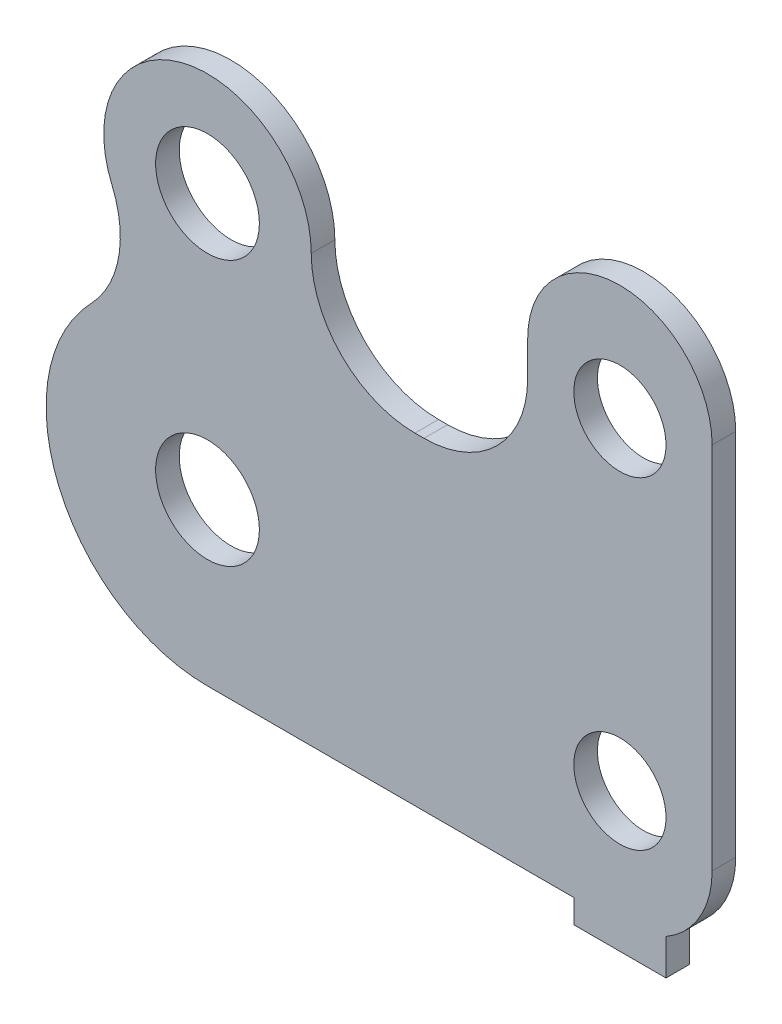
ISO-10303-21;
HEADER;
FILE_DESCRIPTION(('STEP AP214'),'2;1');
FILE_NAME('part.step','',(''),(''),'','','');
FILE_SCHEMA(('AUTOMOTIVE_DESIGN { 1 0 10303 214 1 1 1 1 }'));
ENDSEC;
DATA;
#1=APPLICATION_CONTEXT('core data for automotive mechanical design processes');
#2=APPLICATION_PROTOCOL_DEFINITION('international standard','automotive_design',2000,#1);
#3=PRODUCT_CONTEXT('',#1,'mechanical');
#4=PRODUCT('Part','Part','',(#3));
#5=PRODUCT_RELATED_PRODUCT_CATEGORY('part','',(#4));
#6=PRODUCT_DEFINITION_FORMATION('','',#4);
#7=PRODUCT_DEFINITION_CONTEXT('part definition',#1,'design');
#8=PRODUCT_DEFINITION('design','',#6,#7);
#9=PRODUCT_DEFINITION_SHAPE('','',#8);
#10=(LENGTH_UNIT() NAMED_UNIT(*) SI_UNIT(.MILLI.,.METRE.));
#11=(NAMED_UNIT(*) PLANE_ANGLE_UNIT() SI_UNIT($,.RADIAN.));
#12=(NAMED_UNIT(*) SI_UNIT($,.STERADIAN.) SOLID_ANGLE_UNIT());
#13=UNCERTAINTY_MEASURE_WITH_UNIT(LENGTH_MEASURE(1.E-05),#10,'distance_accuracy_value','');
#14=(GEOMETRIC_REPRESENTATION_CONTEXT(3) GLOBAL_UNCERTAINTY_ASSIGNED_CONTEXT((#13)) GLOBAL_UNIT_ASSIGNED_CONTEXT((#10,
#11,#12)) REPRESENTATION_CONTEXT('',''));
#15=CARTESIAN_POINT('',(0.,0.,0.));
#16=DIRECTION('',(0.,0.,1.));
#17=DIRECTION('',(1.,0.,0.));
#18=AXIS2_PLACEMENT_3D('',#15,#16,#17);
#19=CARTESIAN_POINT('',(12.6115316571236,0.,0.8128));
#20=DIRECTION('',(1.,0.,0.));
#21=DIRECTION('',(0.,1.,0.));
#22=AXIS2_PLACEMENT_3D('',#19,#20,#21);
#23=PLANE('',#22);
#24=DIRECTION('',(0.,-1.,0.));
#25=VECTOR('',#24,1.);
#26=CARTESIAN_POINT('',(12.6115316571236,0.,0.));
#27=LINE('',#26,#25);
#28=CARTESIAN_POINT('',(12.6115316571237,-5.55625,0.));
#29=VERTEX_POINT('',#28);
#30=CARTESIAN_POINT('',(12.6115316571237,-6.36905,0.));
#31=VERTEX_POINT('',#30);
#32=EDGE_CURVE('E159',#29,#31,#27,.T.);
#33=ORIENTED_EDGE('',*,*,#32,.T.);
#34=DIRECTION('',(0.,0.,-1.));
#35=VECTOR('',#34,1.);
#36=CARTESIAN_POINT('',(12.6115316571237,-6.36905,0.8128));
#37=LINE('',#36,#35);
#38=CARTESIAN_POINT('',(12.6115316571237,-6.36905,0.8128));
#39=VERTEX_POINT('',#38);
#40=EDGE_CURVE('E213',#39,#31,#37,.T.);
#41=ORIENTED_EDGE('',*,*,#40,.F.);
#42=DIRECTION('',(0.,-1.,0.));
#43=VECTOR('',#42,1.);
#44=CARTESIAN_POINT('',(12.6115316571236,0.,0.8128));
#45=LINE('',#44,#43);
#46=CARTESIAN_POINT('',(12.6115316571237,-5.55625,0.8128));
#47=VERTEX_POINT('',#46);
#48=EDGE_CURVE('E215',#47,#39,#45,.T.);
#49=ORIENTED_EDGE('',*,*,#48,.F.);
#50=DIRECTION('',(0.,0.,-1.));
#51=VECTOR('',#50,1.);
#52=CARTESIAN_POINT('',(12.6115316571237,-5.55625,0.8128));
#53=LINE('',#52,#51);
#54=EDGE_CURVE('E204',#47,#29,#53,.T.);
#55=ORIENTED_EDGE('',*,*,#54,.T.);
#56=EDGE_LOOP('',(#33,#41,#49,#55));
#57=FACE_BOUND('',#56,.T.);
#58=ADVANCED_FACE('F95',(#57),#23,.F.);
#59=CARTESIAN_POINT('',(0.,-6.36905,0.8128));
#60=DIRECTION('',(0.,1.,0.));
#61=DIRECTION('',(-1.,0.,0.));
#62=AXIS2_PLACEMENT_3D('',#59,#60,#61);
#63=PLANE('',#62);
#64=DIRECTION('',(1.,0.,0.));
#65=VECTOR('',#64,1.);
#66=CARTESIAN_POINT('',(0.,-6.36905,0.));
#67=LINE('',#66,#65);
#68=CARTESIAN_POINT('',(15.7865316571237,-6.36905,0.));
#69=VERTEX_POINT('',#68);
#70=EDGE_CURVE('E298',#31,#69,#67,.T.);
#71=ORIENTED_EDGE('',*,*,#70,.T.);
#72=DIRECTION('',(0.,0.,-1.));
#73=VECTOR('',#72,1.);
#74=CARTESIAN_POINT('',(15.7865316571237,-6.36905,0.8128));
#75=LINE('',#74,#73);
#76=CARTESIAN_POINT('',(15.7865316571237,-6.36905,0.8128));
#77=VERTEX_POINT('',#76);
#78=EDGE_CURVE('E252',#77,#69,#75,.T.);
#79=ORIENTED_EDGE('',*,*,#78,.F.);
#80=DIRECTION('',(1.,0.,0.));
#81=VECTOR('',#80,1.);
#82=CARTESIAN_POINT('',(0.,-6.36905,0.8128));
#83=LINE('',#82,#81);
#84=EDGE_CURVE('E219',#39,#77,#83,.T.);
#85=ORIENTED_EDGE('',*,*,#84,.F.);
#86=ORIENTED_EDGE('',*,*,#40,.T.);
#87=EDGE_LOOP('',(#71,#79,#85,#86));
#88=FACE_BOUND('',#87,.T.);
#89=ADVANCED_FACE('F418',(#88),#63,.F.);
#90=CARTESIAN_POINT('',(0.,9.128125,0.8128));
#91=DIRECTION('',(0.,0.,-1.));
#92=DIRECTION('',(-1.,0.,0.));
#93=AXIS2_PLACEMENT_3D('',#90,#91,#92);
#94=CYLINDRICAL_SURFACE('',#93,1.7859375);
#95=CARTESIAN_POINT('',(0.,9.128125,0.8128));
#96=DIRECTION('',(0.,0.,1.));
#97=DIRECTION('',(1.,0.,0.));
#98=AXIS2_PLACEMENT_3D('',#95,#96,#97);
#99=CIRCLE('',#98,1.7859375);
#100=CARTESIAN_POINT('',(1.7859375,9.128125,0.8128));
#101=VERTEX_POINT('',#100);
#102=EDGE_CURVE('E248',#101,#101,#99,.T.);
#103=ORIENTED_EDGE('',*,*,#102,.T.);
#104=EDGE_LOOP('',(#103));
#105=FACE_BOUND('',#104,.T.);
#106=CARTESIAN_POINT('',(0.,9.128125,0.));
#107=DIRECTION('',(0.,0.,1.));
#108=DIRECTION('',(1.,0.,0.));
#109=AXIS2_PLACEMENT_3D('',#106,#107,#108);
#110=CIRCLE('',#109,1.7859375);
#111=CARTESIAN_POINT('',(1.7859375,9.128125,0.));
#112=VERTEX_POINT('',#111);
#113=EDGE_CURVE('E314',#112,#112,#110,.T.);
#114=ORIENTED_EDGE('',*,*,#113,.F.);
#115=EDGE_LOOP('',(#114));
#116=FACE_BOUND('',#115,.T.);
#117=ADVANCED_FACE('F420',(#105,#116),#94,.F.);
#118=CARTESIAN_POINT('',(14.1990316571237,-1.5875,0.8128));
#119=DIRECTION('',(0.,0.,-1.));
#120=DIRECTION('',(-1.,0.,0.));
#121=AXIS2_PLACEMENT_3D('',#118,#119,#120);
#122=CYLINDRICAL_SURFACE('',#121,1.5875);
#123=CARTESIAN_POINT('',(14.1990316571237,-1.5875,0.8128));
#124=DIRECTION('',(0.,0.,1.));
#125=DIRECTION('',(1.,0.,0.));
#126=AXIS2_PLACEMENT_3D('',#123,#124,#125);
#127=CIRCLE('',#126,1.5875);
#128=CARTESIAN_POINT('',(15.7865316571237,-1.5875,0.8128));
#129=VERTEX_POINT('',#128);
#130=EDGE_CURVE('E244',#129,#129,#127,.T.);
#131=ORIENTED_EDGE('',*,*,#130,.T.);
#132=EDGE_LOOP('',(#131));
#133=FACE_BOUND('',#132,.T.);
#134=CARTESIAN_POINT('',(14.1990316571237,-1.5875,0.));
#135=DIRECTION('',(0.,0.,1.));
#136=DIRECTION('',(1.,0.,0.));
#137=AXIS2_PLACEMENT_3D('',#134,#135,#136);
#138=CIRCLE('',#137,1.5875);
#139=CARTESIAN_POINT('',(15.7865316571237,-1.5875,0.));
#140=VERTEX_POINT('',#139);
#141=EDGE_CURVE('E310',#140,#140,#138,.T.);
#142=ORIENTED_EDGE('',*,*,#141,.F.);
#143=EDGE_LOOP('',(#142));
#144=FACE_BOUND('',#143,.T.);
#145=ADVANCED_FACE('F427',(#133,#144),#122,.F.);
#146=CARTESIAN_POINT('',(14.1990316571237,9.525,0.8128));
#147=DIRECTION('',(0.,0.,-1.));
#148=DIRECTION('',(-1.,0.,0.));
#149=AXIS2_PLACEMENT_3D('',#146,#147,#148);
#150=CYLINDRICAL_SURFACE('',#149,1.5875);
#151=CARTESIAN_POINT('',(14.1990316571237,9.525,0.8128));
#152=DIRECTION('',(0.,0.,1.));
#153=DIRECTION('',(1.,0.,0.));
#154=AXIS2_PLACEMENT_3D('',#151,#152,#153);
#155=CIRCLE('',#154,1.5875);
#156=CARTESIAN_POINT('',(15.7865316571237,9.525,0.8128));
#157=VERTEX_POINT('',#156);
#158=EDGE_CURVE('E240',#157,#157,#155,.T.);
#159=ORIENTED_EDGE('',*,*,#158,.T.);
#160=EDGE_LOOP('',(#159));
#161=FACE_BOUND('',#160,.T.);
#162=CARTESIAN_POINT('',(14.1990316571237,9.525,0.));
#163=DIRECTION('',(0.,0.,1.));
#164=DIRECTION('',(1.,0.,0.));
#165=AXIS2_PLACEMENT_3D('',#162,#163,#164);
#166=CIRCLE('',#165,1.5875);
#167=CARTESIAN_POINT('',(15.7865316571237,9.525,0.));
#168=VERTEX_POINT('',#167);
#169=EDGE_CURVE('E306',#168,#168,#166,.T.);
#170=ORIENTED_EDGE('',*,*,#169,.F.);
#171=EDGE_LOOP('',(#170));
#172=FACE_BOUND('',#171,.T.);
#173=ADVANCED_FACE('F433',(#161,#172),#150,.F.);
#174=CARTESIAN_POINT('',(0.,0.,0.8128));
#175=DIRECTION('',(0.,0.,-1.));
#176=DIRECTION('',(-1.,0.,0.));
#177=AXIS2_PLACEMENT_3D('',#174,#175,#176);
#178=CYLINDRICAL_SURFACE('',#177,1.7859375);
#179=CARTESIAN_POINT('',(0.,0.,0.8128));
#180=DIRECTION('',(0.,0.,1.));
#181=DIRECTION('',(1.,0.,0.));
#182=AXIS2_PLACEMENT_3D('',#179,#180,#181);
#183=CIRCLE('',#182,1.7859375);
#184=CARTESIAN_POINT('',(1.7859375,0.,0.8128));
#185=VERTEX_POINT('',#184);
#186=EDGE_CURVE('E236',#185,#185,#183,.T.);
#187=ORIENTED_EDGE('',*,*,#186,.T.);
#188=EDGE_LOOP('',(#187));
#189=FACE_BOUND('',#188,.T.);
#190=CARTESIAN_POINT('',(0.,0.,0.));
#191=DIRECTION('',(0.,0.,1.));
#192=DIRECTION('',(1.,0.,0.));
#193=AXIS2_PLACEMENT_3D('',#190,#191,#192);
#194=CIRCLE('',#193,1.7859375);
#195=CARTESIAN_POINT('',(1.7859375,0.,0.));
#196=VERTEX_POINT('',#195);
#197=EDGE_CURVE('E302',#196,#196,#194,.T.);
#198=ORIENTED_EDGE('',*,*,#197,.F.);
#199=EDGE_LOOP('',(#198));
#200=FACE_BOUND('',#199,.T.);
#201=ADVANCED_FACE('F442',(#189,#200),#178,.F.);
#202=CARTESIAN_POINT('',(14.1990316571237,-2.38125,0.8128));
#203=DIRECTION('',(0.,0.,-1.));
#204=DIRECTION('',(-1.,0.,0.));
#205=AXIS2_PLACEMENT_3D('',#202,#203,#204);
#206=CYLINDRICAL_SURFACE('',#205,3.175);
#207=CARTESIAN_POINT('',(14.1990316571237,-2.38125,0.));
#208=DIRECTION('',(0.,0.,1.));
#209=DIRECTION('',(1.,0.,0.));
#210=AXIS2_PLACEMENT_3D('',#207,#208,#209);
#211=CIRCLE('',#210,3.175);
#212=CARTESIAN_POINT('',(15.7865316571237,-5.1308806570156,0.));
#213=VERTEX_POINT('',#212);
#214=CARTESIAN_POINT('',(17.3740316571237,-2.38125,0.));
#215=VERTEX_POINT('',#214);
#216=EDGE_CURVE('E255',#213,#215,#211,.T.);
#217=ORIENTED_EDGE('',*,*,#216,.T.);
#218=DIRECTION('',(0.,0.,-1.));
#219=VECTOR('',#218,1.);
#220=CARTESIAN_POINT('',(17.3740316571237,-2.38125,0.8128));
#221=LINE('',#220,#219);
#222=CARTESIAN_POINT('',(17.3740316571237,-2.38125,0.8128));
#223=VERTEX_POINT('',#222);
#224=EDGE_CURVE('E105',#223,#215,#221,.T.);
#225=ORIENTED_EDGE('',*,*,#224,.F.);
#226=CARTESIAN_POINT('',(14.1990316571237,-2.38125,0.8128));
#227=DIRECTION('',(0.,0.,1.));
#228=DIRECTION('',(1.,0.,0.));
#229=AXIS2_PLACEMENT_3D('',#226,#227,#228);
#230=CIRCLE('',#229,3.175);
#231=CARTESIAN_POINT('',(15.7865316571237,-5.1308806570156,0.8128));
#232=VERTEX_POINT('',#231);
#233=EDGE_CURVE('E691',#232,#223,#230,.T.);
#234=ORIENTED_EDGE('',*,*,#233,.F.);
#235=DIRECTION('',(0.,0.,-1.));
#236=VECTOR('',#235,1.);
#237=CARTESIAN_POINT('',(15.7865316571237,-5.1308806570156,0.8128));
#238=LINE('',#237,#236);
#239=EDGE_CURVE('E12',#232,#213,#238,.T.);
#240=ORIENTED_EDGE('',*,*,#239,.T.);
#241=EDGE_LOOP('',(#217,#225,#234,#240));
#242=FACE_BOUND('',#241,.T.);
#243=ADVANCED_FACE('F357',(#242),#206,.T.);
#244=CARTESIAN_POINT('',(17.3740316571237,0.,0.8128));
#245=DIRECTION('',(1.,0.,0.));
#246=DIRECTION('',(0.,0.,-1.));
#247=AXIS2_PLACEMENT_3D('',#244,#245,#246);
#248=PLANE('',#247);
#249=DIRECTION('',(0.,-1.,0.));
#250=VECTOR('',#249,1.);
#251=CARTESIAN_POINT('',(17.3740316571237,0.,0.));
#252=LINE('',#251,#250);
#253=CARTESIAN_POINT('',(17.3740316571237,10.31875,0.));
#254=VERTEX_POINT('',#253);
#255=EDGE_CURVE('E259',#254,#215,#252,.T.);
#256=ORIENTED_EDGE('',*,*,#255,.F.);
#257=DIRECTION('',(0.,0.,-1.));
#258=VECTOR('',#257,1.);
#259=CARTESIAN_POINT('',(17.3740316571237,10.31875,0.8128));
#260=LINE('',#259,#258);
#261=CARTESIAN_POINT('',(17.3740316571237,10.31875,0.8128));
#262=VERTEX_POINT('',#261);
#263=EDGE_CURVE('E346',#262,#254,#260,.T.);
#264=ORIENTED_EDGE('',*,*,#263,.F.);
#265=DIRECTION('',(0.,-1.,0.));
#266=VECTOR('',#265,1.);
#267=CARTESIAN_POINT('',(17.3740316571237,0.,0.8128));
#268=LINE('',#267,#266);
#269=EDGE_CURVE('E355',#262,#223,#268,.T.);
#270=ORIENTED_EDGE('',*,*,#269,.T.);
#271=ORIENTED_EDGE('',*,*,#224,.T.);
#272=EDGE_LOOP('',(#256,#264,#270,#271));
#273=FACE_BOUND('',#272,.T.);
#274=ADVANCED_FACE('F353',(#273),#248,.T.);
#275=CARTESIAN_POINT('',(14.1990316571237,10.31875,0.8128));
#276=DIRECTION('',(0.,0.,-1.));
#277=DIRECTION('',(-1.,0.,0.));
#278=AXIS2_PLACEMENT_3D('',#275,#276,#277);
#279=CYLINDRICAL_SURFACE('',#278,3.175);
#280=CARTESIAN_POINT('',(14.1990316571237,10.31875,0.));
#281=DIRECTION('',(0.,0.,1.));
#282=DIRECTION('',(1.,0.,0.));
#283=AXIS2_PLACEMENT_3D('',#280,#281,#282);
#284=CIRCLE('',#283,3.175);
#285=CARTESIAN_POINT('',(11.0240316571237,10.31875,0.));
#286=VERTEX_POINT('',#285);
#287=EDGE_CURVE('E263',#254,#286,#284,.T.);
#288=ORIENTED_EDGE('',*,*,#287,.T.);
#289=DIRECTION('',(0.,0.,-1.));
#290=VECTOR('',#289,1.);
#291=CARTESIAN_POINT('',(11.0240316571237,10.31875,0.8128));
#292=LINE('',#291,#290);
#293=CARTESIAN_POINT('',(11.0240316571237,10.31875,0.8128));
#294=VERTEX_POINT('',#293);
#295=EDGE_CURVE('E342',#294,#286,#292,.T.);
#296=ORIENTED_EDGE('',*,*,#295,.F.);
#297=CARTESIAN_POINT('',(14.1990316571237,10.31875,0.8128));
#298=DIRECTION('',(0.,0.,1.));
#299=DIRECTION('',(1.,0.,0.));
#300=AXIS2_PLACEMENT_3D('',#297,#298,#299);
#301=CIRCLE('',#300,3.175);
#302=EDGE_CURVE('E375',#262,#294,#301,.T.);
#303=ORIENTED_EDGE('',*,*,#302,.F.);
#304=ORIENTED_EDGE('',*,*,#263,.T.);
#305=EDGE_LOOP('',(#288,#296,#303,#304));
#306=FACE_BOUND('',#305,.T.);
#307=ADVANCED_FACE('F364',(#306),#279,.T.);
#308=CARTESIAN_POINT('',(11.0240316571237,0.,0.8128));
#309=DIRECTION('',(1.,0.,0.));
#310=DIRECTION('',(0.,1.,0.));
#311=AXIS2_PLACEMENT_3D('',#308,#309,#310);
#312=PLANE('',#311);
#313=DIRECTION('',(0.,-1.,0.));
#314=VECTOR('',#313,1.);
#315=CARTESIAN_POINT('',(11.0240316571237,0.,0.));
#316=LINE('',#315,#314);
#317=CARTESIAN_POINT('',(11.0240316571237,9.128125,0.));
#318=VERTEX_POINT('',#317);
#319=EDGE_CURVE('E266',#286,#318,#316,.T.);
#320=ORIENTED_EDGE('',*,*,#319,.T.);
#321=DIRECTION('',(0.,0.,-1.));
#322=VECTOR('',#321,1.);
#323=CARTESIAN_POINT('',(11.0240316571237,9.128125,0.8128));
#324=LINE('',#323,#322);
#325=CARTESIAN_POINT('',(11.0240316571237,9.128125,0.8128));
#326=VERTEX_POINT('',#325);
#327=EDGE_CURVE('E339',#326,#318,#324,.T.);
#328=ORIENTED_EDGE('',*,*,#327,.F.);
#329=DIRECTION('',(0.,-1.,0.));
#330=VECTOR('',#329,1.);
#331=CARTESIAN_POINT('',(11.0240316571237,0.,0.8128));
#332=LINE('',#331,#330);
#333=EDGE_CURVE('E370',#294,#326,#332,.T.);
#334=ORIENTED_EDGE('',*,*,#333,.F.);
#335=ORIENTED_EDGE('',*,*,#295,.T.);
#336=EDGE_LOOP('',(#320,#328,#334,#335));
#337=FACE_BOUND('',#336,.T.);
#338=ADVANCED_FACE('F368',(#337),#312,.F.);
#339=CARTESIAN_POINT('',(7.45215665712367,9.128125,0.8128));
#340=DIRECTION('',(0.,0.,-1.));
#341=DIRECTION('',(-1.,0.,0.));
#342=AXIS2_PLACEMENT_3D('',#339,#340,#341);
#343=CYLINDRICAL_SURFACE('',#342,3.571875);
#344=CARTESIAN_POINT('',(7.45215665712367,9.128125,0.));
#345=DIRECTION('',(0.,0.,1.));
#346=DIRECTION('',(1.,0.,0.));
#347=AXIS2_PLACEMENT_3D('',#344,#345,#346);
#348=CIRCLE('',#347,3.571875);
#349=CARTESIAN_POINT('',(7.45215665712367,5.55625,0.));
#350=VERTEX_POINT('',#349);
#351=EDGE_CURVE('E270',#350,#318,#348,.T.);
#352=ORIENTED_EDGE('',*,*,#351,.F.);
#353=DIRECTION('',(0.,0.,-1.));
#354=VECTOR('',#353,1.);
#355=CARTESIAN_POINT('',(7.45215665712367,5.55625,0.8128));
#356=LINE('',#355,#354);
#357=CARTESIAN_POINT('',(7.45215665712367,5.55625,0.8128));
#358=VERTEX_POINT('',#357);
#359=EDGE_CURVE('E336',#358,#350,#356,.T.);
#360=ORIENTED_EDGE('',*,*,#359,.F.);
#361=CARTESIAN_POINT('',(7.45215665712367,9.128125,0.8128));
#362=DIRECTION('',(0.,0.,1.));
#363=DIRECTION('',(1.,0.,0.));
#364=AXIS2_PLACEMENT_3D('',#361,#362,#363);
#365=CIRCLE('',#364,3.571875);
#366=EDGE_CURVE('E374',#358,#326,#365,.T.);
#367=ORIENTED_EDGE('',*,*,#366,.T.);
#368=ORIENTED_EDGE('',*,*,#327,.T.);
#369=EDGE_LOOP('',(#352,#360,#367,#368));
#370=FACE_BOUND('',#369,.T.);
#371=ADVANCED_FACE('F511',(#370),#343,.F.);
#372=CARTESIAN_POINT('',(0.,5.55625,0.8128));
#373=DIRECTION('',(0.,1.,0.));
#374=DIRECTION('',(-1.,0.,0.));
#375=AXIS2_PLACEMENT_3D('',#372,#373,#374);
#376=PLANE('',#375);
#377=DIRECTION('',(1.,0.,0.));
#378=VECTOR('',#377,1.);
#379=CARTESIAN_POINT('',(0.,5.55625,0.));
#380=LINE('',#379,#378);
#381=CARTESIAN_POINT('',(7.14375,5.55625,0.));
#382=VERTEX_POINT('',#381);
#383=EDGE_CURVE('E274',#382,#350,#380,.T.);
#384=ORIENTED_EDGE('',*,*,#383,.F.);
#385=DIRECTION('',(0.,0.,-1.));
#386=VECTOR('',#385,1.);
#387=CARTESIAN_POINT('',(7.14375,5.55625,0.8128));
#388=LINE('',#387,#386);
#389=CARTESIAN_POINT('',(7.14375,5.55625,0.8128));
#390=VERTEX_POINT('',#389);
#391=EDGE_CURVE('E333',#390,#382,#388,.T.);
#392=ORIENTED_EDGE('',*,*,#391,.F.);
#393=DIRECTION('',(1.,0.,0.));
#394=VECTOR('',#393,1.);
#395=CARTESIAN_POINT('',(0.,5.55625,0.8128));
#396=LINE('',#395,#394);
#397=EDGE_CURVE('E379',#390,#358,#396,.T.);
#398=ORIENTED_EDGE('',*,*,#397,.T.);
#399=ORIENTED_EDGE('',*,*,#359,.T.);
#400=EDGE_LOOP('',(#384,#392,#398,#399));
#401=FACE_BOUND('',#400,.T.);
#402=ADVANCED_FACE('F501',(#401),#376,.T.);
#403=CARTESIAN_POINT('',(7.14375,9.128125,0.8128));
#404=DIRECTION('',(0.,0.,-1.));
#405=DIRECTION('',(-1.,0.,0.));
#406=AXIS2_PLACEMENT_3D('',#403,#404,#405);
#407=CYLINDRICAL_SURFACE('',#406,3.571875);
#408=CARTESIAN_POINT('',(7.14375,9.128125,0.));
#409=DIRECTION('',(0.,0.,1.));
#410=DIRECTION('',(1.,0.,0.));
#411=AXIS2_PLACEMENT_3D('',#408,#409,#410);
#412=CIRCLE('',#411,3.571875);
#413=CARTESIAN_POINT('',(3.571875,9.128125,0.));
#414=VERTEX_POINT('',#413);
#415=EDGE_CURVE('E278',#414,#382,#412,.T.);
#416=ORIENTED_EDGE('',*,*,#415,.F.);
#417=DIRECTION('',(0.,0.,-1.));
#418=VECTOR('',#417,1.);
#419=CARTESIAN_POINT('',(3.571875,9.128125,0.8128));
#420=LINE('',#419,#418);
#421=CARTESIAN_POINT('',(3.571875,9.128125,0.8128));
#422=VERTEX_POINT('',#421);
#423=EDGE_CURVE('E330',#422,#414,#420,.T.);
#424=ORIENTED_EDGE('',*,*,#423,.F.);
#425=CARTESIAN_POINT('',(7.14375,9.128125,0.8128));
#426=DIRECTION('',(0.,0.,1.));
#427=DIRECTION('',(1.,0.,0.));
#428=AXIS2_PLACEMENT_3D('',#425,#426,#427);
#429=CIRCLE('',#428,3.571875);
#430=EDGE_CURVE('E387',#422,#390,#429,.T.);
#431=ORIENTED_EDGE('',*,*,#430,.T.);
#432=ORIENTED_EDGE('',*,*,#391,.T.);
#433=EDGE_LOOP('',(#416,#424,#431,#432));
#434=FACE_BOUND('',#433,.T.);
#435=ADVANCED_FACE('F492',(#434),#407,.F.);
#436=CARTESIAN_POINT('',(0.,9.128125,0.8128));
#437=DIRECTION('',(0.,0.,-1.));
#438=DIRECTION('',(-1.,0.,0.));
#439=AXIS2_PLACEMENT_3D('',#436,#437,#438);
#440=CYLINDRICAL_SURFACE('',#439,3.571875);
#441=CARTESIAN_POINT('',(0.,9.128125,0.));
#442=DIRECTION('',(0.,0.,1.));
#443=DIRECTION('',(1.,0.,0.));
#444=AXIS2_PLACEMENT_3D('',#441,#442,#443);
#445=CIRCLE('',#444,3.571875);
#446=CARTESIAN_POINT('',(-3.28705842233351,7.73043478260869,0.));
#447=VERTEX_POINT('',#446);
#448=EDGE_CURVE('E282',#414,#447,#445,.T.);
#449=ORIENTED_EDGE('',*,*,#448,.T.);
#450=DIRECTION('',(0.,0.,-1.));
#451=VECTOR('',#450,1.);
#452=CARTESIAN_POINT('',(-3.28705842233351,7.73043478260869,0.8128));
#453=LINE('',#452,#451);
#454=CARTESIAN_POINT('',(-3.28705842233351,7.73043478260869,0.8128));
#455=VERTEX_POINT('',#454);
#456=EDGE_CURVE('E327',#455,#447,#453,.T.);
#457=ORIENTED_EDGE('',*,*,#456,.F.);
#458=CARTESIAN_POINT('',(0.,9.128125,0.8128));
#459=DIRECTION('',(0.,0.,1.));
#460=DIRECTION('',(1.,0.,0.));
#461=AXIS2_PLACEMENT_3D('',#458,#459,#460);
#462=CIRCLE('',#461,3.571875);
#463=EDGE_CURVE('E391',#422,#455,#462,.T.);
#464=ORIENTED_EDGE('',*,*,#463,.F.);
#465=ORIENTED_EDGE('',*,*,#423,.T.);
#466=EDGE_LOOP('',(#449,#457,#464,#465));
#467=FACE_BOUND('',#466,.T.);
#468=ADVANCED_FACE('F403',(#467),#440,.T.);
#469=CARTESIAN_POINT('',(-6.57411684466701,6.33274456521739,0.8128));
#470=DIRECTION('',(0.,0.,-1.));
#471=DIRECTION('',(-1.,0.,0.));
#472=AXIS2_PLACEMENT_3D('',#469,#470,#471);
#473=CYLINDRICAL_SURFACE('',#472,3.571875);
#474=CARTESIAN_POINT('',(-6.57411684466701,6.33274456521739,0.));
#475=DIRECTION('',(0.,0.,1.));
#476=DIRECTION('',(1.,0.,0.));
#477=AXIS2_PLACEMENT_3D('',#474,#475,#476);
#478=CIRCLE('',#477,3.571875);
#479=CARTESIAN_POINT('',(-4.0016363402321,3.8547140831758,0.));
#480=VERTEX_POINT('',#479);
#481=EDGE_CURVE('E286',#480,#447,#478,.T.);
#482=ORIENTED_EDGE('',*,*,#481,.F.);
#483=DIRECTION('',(0.,0.,-1.));
#484=VECTOR('',#483,1.);
#485=CARTESIAN_POINT('',(-4.0016363402321,3.8547140831758,0.8128));
#486=LINE('',#485,#484);
#487=CARTESIAN_POINT('',(-4.0016363402321,3.8547140831758,0.8128));
#488=VERTEX_POINT('',#487);
#489=EDGE_CURVE('E324',#488,#480,#486,.T.);
#490=ORIENTED_EDGE('',*,*,#489,.F.);
#491=CARTESIAN_POINT('',(-6.57411684466701,6.33274456521739,0.8128));
#492=DIRECTION('',(0.,0.,1.));
#493=DIRECTION('',(1.,0.,0.));
#494=AXIS2_PLACEMENT_3D('',#491,#492,#493);
#495=CIRCLE('',#494,3.571875);
#496=EDGE_CURVE('E230',#488,#455,#495,.T.);
#497=ORIENTED_EDGE('',*,*,#496,.T.);
#498=ORIENTED_EDGE('',*,*,#456,.T.);
#499=EDGE_LOOP('',(#482,#490,#497,#498));
#500=FACE_BOUND('',#499,.T.);
#501=ADVANCED_FACE('F397',(#500),#473,.F.);
#502=CARTESIAN_POINT('',(0.,0.,0.8128));
#503=DIRECTION('',(0.,0.,-1.));
#504=DIRECTION('',(-1.,0.,0.));
#505=AXIS2_PLACEMENT_3D('',#502,#503,#504);
#506=CYLINDRICAL_SURFACE('',#505,5.55625);
#507=CARTESIAN_POINT('',(0.,0.,0.));
#508=DIRECTION('',(0.,0.,1.));
#509=DIRECTION('',(1.,0.,0.));
#510=AXIS2_PLACEMENT_3D('',#507,#508,#509);
#511=CIRCLE('',#510,5.55625);
#512=CARTESIAN_POINT('',(0.,-5.55625,0.));
#513=VERTEX_POINT('',#512);
#514=EDGE_CURVE('E290',#480,#513,#511,.T.);
#515=ORIENTED_EDGE('',*,*,#514,.T.);
#516=DIRECTION('',(0.,0.,-1.));
#517=VECTOR('',#516,1.);
#518=CARTESIAN_POINT('',(0.,-5.55625,0.8128));
#519=LINE('',#518,#517);
#520=CARTESIAN_POINT('',(0.,-5.55625,0.8128));
#521=VERTEX_POINT('',#520);
#522=EDGE_CURVE('E212',#521,#513,#519,.T.);
#523=ORIENTED_EDGE('',*,*,#522,.F.);
#524=CARTESIAN_POINT('',(0.,0.,0.8128));
#525=DIRECTION('',(0.,0.,1.));
#526=DIRECTION('',(1.,0.,0.));
#527=AXIS2_PLACEMENT_3D('',#524,#525,#526);
#528=CIRCLE('',#527,5.55625);
#529=EDGE_CURVE('E225',#488,#521,#528,.T.);
#530=ORIENTED_EDGE('',*,*,#529,.F.);
#531=ORIENTED_EDGE('',*,*,#489,.T.);
#532=EDGE_LOOP('',(#515,#523,#530,#531));
#533=FACE_BOUND('',#532,.T.);
#534=ADVANCED_FACE('F408',(#533),#506,.T.);
#535=CARTESIAN_POINT('',(0.,-5.55625,0.8128));
#536=DIRECTION('',(0.,-1.,0.));
#537=DIRECTION('',(1.,0.,0.));
#538=AXIS2_PLACEMENT_3D('',#535,#536,#537);
#539=PLANE('',#538);
#540=DIRECTION('',(-1.,0.,0.));
#541=VECTOR('',#540,1.);
#542=CARTESIAN_POINT('',(0.,-5.55625,0.));
#543=LINE('',#542,#541);
#544=EDGE_CURVE('E210',#29,#513,#543,.T.);
#545=ORIENTED_EDGE('',*,*,#544,.F.);
#546=ORIENTED_EDGE('',*,*,#54,.F.);
#547=DIRECTION('',(-1.,0.,0.));
#548=VECTOR('',#547,1.);
#549=CARTESIAN_POINT('',(0.,-5.55625,0.8128));
#550=LINE('',#549,#548);
#551=EDGE_CURVE('E208',#47,#521,#550,.T.);
#552=ORIENTED_EDGE('',*,*,#551,.T.);
#553=ORIENTED_EDGE('',*,*,#522,.T.);
#554=EDGE_LOOP('',(#545,#546,#552,#553));
#555=FACE_BOUND('',#554,.T.);
#556=ADVANCED_FACE('F206',(#555),#539,.T.);
#557=CARTESIAN_POINT('',(15.7865316571237,0.,0.8128));
#558=DIRECTION('',(1.,0.,0.));
#559=DIRECTION('',(0.,0.,-1.));
#560=AXIS2_PLACEMENT_3D('',#557,#558,#559);
#561=PLANE('',#560);
#562=DIRECTION('',(0.,-1.,0.));
#563=VECTOR('',#562,1.);
#564=CARTESIAN_POINT('',(15.7865316571237,0.,0.8128));
#565=LINE('',#564,#563);
#566=EDGE_CURVE('E113',#232,#77,#565,.T.);
#567=ORIENTED_EDGE('',*,*,#566,.T.);
#568=ORIENTED_EDGE('',*,*,#78,.T.);
#569=DIRECTION('',(0.,-1.,0.));
#570=VECTOR('',#569,1.);
#571=CARTESIAN_POINT('',(15.7865316571237,0.,0.));
#572=LINE('',#571,#570);
#573=EDGE_CURVE('E167',#213,#69,#572,.T.);
#574=ORIENTED_EDGE('',*,*,#573,.F.);
#575=ORIENTED_EDGE('',*,*,#239,.F.);
#576=EDGE_LOOP('',(#567,#568,#574,#575));
#577=FACE_BOUND('',#576,.T.);
#578=ADVANCED_FACE('F97',(#577),#561,.T.);
#579=CARTESIAN_POINT('',(0.,0.,0.));
#580=DIRECTION('',(0.,0.,1.));
#581=DIRECTION('',(1.,0.,0.));
#582=AXIS2_PLACEMENT_3D('',#579,#580,#581);
#583=PLANE('',#582);
#584=ORIENTED_EDGE('',*,*,#573,.T.);
#585=ORIENTED_EDGE('',*,*,#70,.F.);
#586=ORIENTED_EDGE('',*,*,#32,.F.);
#587=ORIENTED_EDGE('',*,*,#544,.T.);
#588=ORIENTED_EDGE('',*,*,#514,.F.);
#589=ORIENTED_EDGE('',*,*,#481,.T.);
#590=ORIENTED_EDGE('',*,*,#448,.F.);
#591=ORIENTED_EDGE('',*,*,#415,.T.);
#592=ORIENTED_EDGE('',*,*,#383,.T.);
#593=ORIENTED_EDGE('',*,*,#351,.T.);
#594=ORIENTED_EDGE('',*,*,#319,.F.);
#595=ORIENTED_EDGE('',*,*,#287,.F.);
#596=ORIENTED_EDGE('',*,*,#255,.T.);
#597=ORIENTED_EDGE('',*,*,#216,.F.);
#598=EDGE_LOOP('',(#584,#585,#586,#587,#588,#589,#590,#591,#592,#593,#594,#595,#596,#597));
#599=FACE_BOUND('',#598,.T.);
#600=ORIENTED_EDGE('',*,*,#197,.T.);
#601=EDGE_LOOP('',(#600));
#602=FACE_BOUND('',#601,.T.);
#603=ORIENTED_EDGE('',*,*,#169,.T.);
#604=EDGE_LOOP('',(#603));
#605=FACE_BOUND('',#604,.T.);
#606=ORIENTED_EDGE('',*,*,#141,.T.);
#607=EDGE_LOOP('',(#606));
#608=FACE_BOUND('',#607,.T.);
#609=ORIENTED_EDGE('',*,*,#113,.T.);
#610=EDGE_LOOP('',(#609));
#611=FACE_BOUND('',#610,.T.);
#612=ADVANCED_FACE('F359',(#599,#602,#605,#608,#611),#583,.F.);
#613=CARTESIAN_POINT('',(0.,0.,0.8128));
#614=DIRECTION('',(0.,0.,1.));
#615=DIRECTION('',(1.,0.,0.));
#616=AXIS2_PLACEMENT_3D('',#613,#614,#615);
#617=PLANE('',#616);
#618=ORIENTED_EDGE('',*,*,#551,.F.);
#619=ORIENTED_EDGE('',*,*,#48,.T.);
#620=ORIENTED_EDGE('',*,*,#84,.T.);
#621=ORIENTED_EDGE('',*,*,#566,.F.);
#622=ORIENTED_EDGE('',*,*,#233,.T.);
#623=ORIENTED_EDGE('',*,*,#269,.F.);
#624=ORIENTED_EDGE('',*,*,#302,.T.);
#625=ORIENTED_EDGE('',*,*,#333,.T.);
#626=ORIENTED_EDGE('',*,*,#366,.F.);
#627=ORIENTED_EDGE('',*,*,#397,.F.);
#628=ORIENTED_EDGE('',*,*,#430,.F.);
#629=ORIENTED_EDGE('',*,*,#463,.T.);
#630=ORIENTED_EDGE('',*,*,#496,.F.);
#631=ORIENTED_EDGE('',*,*,#529,.T.);
#632=EDGE_LOOP('',(#618,#619,#620,#621,#622,#623,#624,#625,#626,#627,#628,#629,#630,#631));
#633=FACE_BOUND('',#632,.T.);
#634=ORIENTED_EDGE('',*,*,#186,.F.);
#635=EDGE_LOOP('',(#634));
#636=FACE_BOUND('',#635,.T.);
#637=ORIENTED_EDGE('',*,*,#158,.F.);
#638=EDGE_LOOP('',(#637));
#639=FACE_BOUND('',#638,.T.);
#640=ORIENTED_EDGE('',*,*,#130,.F.);
#641=EDGE_LOOP('',(#640));
#642=FACE_BOUND('',#641,.T.);
#643=ORIENTED_EDGE('',*,*,#102,.F.);
#644=EDGE_LOOP('',(#643));
#645=FACE_BOUND('',#644,.T.);
#646=ADVANCED_FACE('F221',(#633,#636,#639,#642,#645),#617,.T.);
#647=CLOSED_SHELL('',(#58,#89,#117,#145,#173,#201,#243,#274,#307,#338,#371,#402,#435,#468,#501,
#534,#556,#578,#612,#646));
#648=MANIFOLD_SOLID_BREP('B2',#647);
#649=ADVANCED_BREP_SHAPE_REPRESENTATION('',(#18,#648),#14);
#650=SHAPE_DEFINITION_REPRESENTATION(#9,#649);
ENDSEC;
END-ISO-10303-21;
